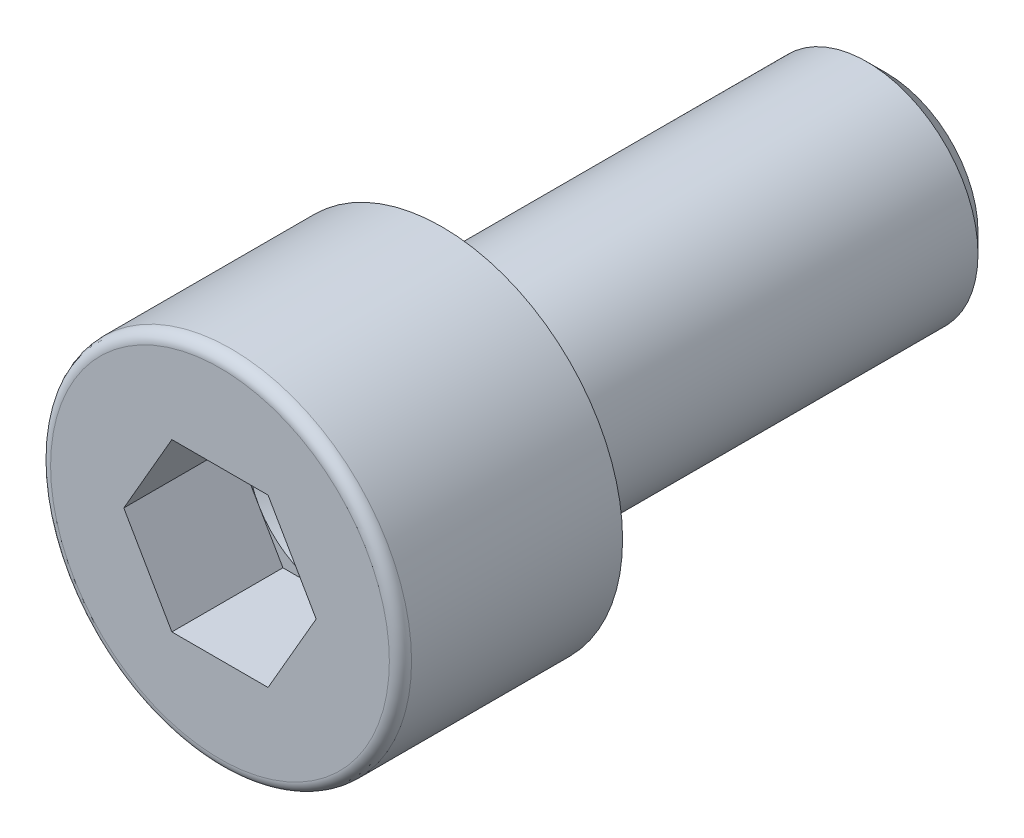
ISO-10303-21;
HEADER;
FILE_DESCRIPTION(('STEP AP214'),'2;1');
FILE_NAME('part.step','',(''),(''),'','','');
FILE_SCHEMA(('AUTOMOTIVE_DESIGN { 1 0 10303 214 1 1 1 1 }'));
ENDSEC;
DATA;
#1=APPLICATION_CONTEXT('core data for automotive mechanical design processes');
#2=APPLICATION_PROTOCOL_DEFINITION('international standard','automotive_design',2000,#1);
#3=PRODUCT_CONTEXT('',#1,'mechanical');
#4=PRODUCT('Part','Part','',(#3));
#5=PRODUCT_RELATED_PRODUCT_CATEGORY('part','',(#4));
#6=PRODUCT_DEFINITION_FORMATION('','',#4);
#7=PRODUCT_DEFINITION_CONTEXT('part definition',#1,'design');
#8=PRODUCT_DEFINITION('design','',#6,#7);
#9=PRODUCT_DEFINITION_SHAPE('','',#8);
#10=(LENGTH_UNIT() NAMED_UNIT(*) SI_UNIT(.MILLI.,.METRE.));
#11=(NAMED_UNIT(*) PLANE_ANGLE_UNIT() SI_UNIT($,.RADIAN.));
#12=(NAMED_UNIT(*) SI_UNIT($,.STERADIAN.) SOLID_ANGLE_UNIT());
#13=UNCERTAINTY_MEASURE_WITH_UNIT(LENGTH_MEASURE(1.E-05),#10,'distance_accuracy_value','');
#14=(GEOMETRIC_REPRESENTATION_CONTEXT(3) GLOBAL_UNCERTAINTY_ASSIGNED_CONTEXT((#13)) GLOBAL_UNIT_ASSIGNED_CONTEXT((#10,
#11,#12)) REPRESENTATION_CONTEXT('',''));
#15=CARTESIAN_POINT('',(0.,0.,0.));
#16=DIRECTION('',(0.,0.,1.));
#17=DIRECTION('',(1.,0.,0.));
#18=AXIS2_PLACEMENT_3D('',#15,#16,#17);
#19=CARTESIAN_POINT('',(0.,0.,20.));
#20=DIRECTION('',(0.,0.,1.));
#21=DIRECTION('',(1.,0.,0.));
#22=AXIS2_PLACEMENT_3D('',#19,#20,#21);
#23=PLANE('',#22);
#24=DIRECTION('',(-0.499999997706082,-0.866025405108833,0.));
#25=VECTOR('',#24,1.);
#26=CARTESIAN_POINT('',(-1.73205080757,3.,20.));
#27=LINE('',#26,#25);
#28=CARTESIAN_POINT('',(-1.73205081286727,2.99999999082487,20.));
#29=VERTEX_POINT('',#28);
#30=CARTESIAN_POINT('',(-2.59807622327162,1.49999997477137,20.0000000091248));
#31=VERTEX_POINT('',#30);
#32=EDGE_CURVE('E148',#29,#31,#27,.T.);
#33=ORIENTED_EDGE('',*,*,#32,.T.);
#34=CARTESIAN_POINT('',(0.,-2.75254019880752E-08,20.0000000070565));
#35=DIRECTION('',(0.,0.,1.));
#36=DIRECTION('',(1.,0.,0.));
#37=AXIS2_PLACEMENT_3D('',#34,#35,#36);
#38=CIRCLE('',#37,3.00000000659944);
#39=CARTESIAN_POINT('',(0.,2.99999998953702,20.0000000077467));
#40=VERTEX_POINT('',#39);
#41=EDGE_CURVE('E367',#31,#40,#38,.F.);
#42=ORIENTED_EDGE('',*,*,#41,.T.);
#43=DIRECTION('',(1.,0.,0.));
#44=VECTOR('',#43,1.);
#45=CARTESIAN_POINT('',(0.,2.9999999862373,20.));
#46=LINE('',#45,#44);
#47=EDGE_CURVE('E158',#40,#29,#46,.F.);
#48=ORIENTED_EDGE('',*,*,#47,.T.);
#49=EDGE_LOOP('',(#33,#42,#48));
#50=FACE_BOUND('',#49,.T.);
#51=ADVANCED_FACE('F17',(#50),#23,.T.);
#52=CARTESIAN_POINT('',(0.,0.,20.));
#53=DIRECTION('',(0.,0.,1.));
#54=DIRECTION('',(1.,0.,0.));
#55=AXIS2_PLACEMENT_3D('',#52,#53,#54);
#56=PLANE('',#55);
#57=DIRECTION('',(1.,0.,0.));
#58=VECTOR('',#57,1.);
#59=CARTESIAN_POINT('',(0.,3.,20.));
#60=LINE('',#59,#58);
#61=CARTESIAN_POINT('',(1.73205080757,3.,20.));
#62=VERTEX_POINT('',#61);
#63=EDGE_CURVE('E136',#62,#40,#60,.F.);
#64=ORIENTED_EDGE('',*,*,#63,.T.);
#65=CARTESIAN_POINT('',(0.,-2.75254019880752E-08,20.0000000084368));
#66=DIRECTION('',(0.,0.,1.));
#67=DIRECTION('',(1.,0.,0.));
#68=AXIS2_PLACEMENT_3D('',#65,#66,#67);
#69=CIRCLE('',#68,3.00000000899022);
#70=CARTESIAN_POINT('',(2.59807621731151,1.49999997591554,20.0000000042184));
#71=VERTEX_POINT('',#70);
#72=EDGE_CURVE('E366',#40,#71,#69,.F.);
#73=ORIENTED_EDGE('',*,*,#72,.T.);
#74=DIRECTION('',(-0.499999996558374,0.866025405771463,0.));
#75=VECTOR('',#74,1.);
#76=CARTESIAN_POINT('',(2.5980762173131,1.4999999759128,20.));
#77=LINE('',#76,#75);
#78=EDGE_CURVE('E142',#71,#62,#77,.T.);
#79=ORIENTED_EDGE('',*,*,#78,.T.);
#80=EDGE_LOOP('',(#64,#73,#79));
#81=FACE_BOUND('',#80,.T.);
#82=ADVANCED_FACE('F229',(#81),#56,.T.);
#83=CARTESIAN_POINT('',(0.,0.,20.));
#84=DIRECTION('',(0.,0.,1.));
#85=DIRECTION('',(1.,0.,0.));
#86=AXIS2_PLACEMENT_3D('',#83,#84,#85);
#87=PLANE('',#86);
#88=DIRECTION('',(-0.500000003442113,0.866025401797133,0.));
#89=VECTOR('',#88,1.);
#90=CARTESIAN_POINT('',(3.46410161514,0.,20.));
#91=LINE('',#90,#89);
#92=CARTESIAN_POINT('',(3.46410161513985,1.6133807901543E-13,20.));
#93=VERTEX_POINT('',#92);
#94=EDGE_CURVE('E135',#93,#71,#91,.T.);
#95=ORIENTED_EDGE('',*,*,#94,.T.);
#96=CARTESIAN_POINT('',(0.,-2.75254019880752E-08,20.));
#97=DIRECTION('',(0.,0.,1.));
#98=DIRECTION('',(1.,0.,0.));
#99=AXIS2_PLACEMENT_3D('',#96,#97,#98);
#100=CIRCLE('',#99,2.99999999437717);
#101=CARTESIAN_POINT('',(2.63316874314574,-1.43866982640077,20.0000864466538));
#102=VERTEX_POINT('',#101);
#103=EDGE_CURVE('E200',#71,#102,#100,.F.);
#104=ORIENTED_EDGE('',*,*,#103,.T.);
#105=DIRECTION('',(0.50000000000019,0.866025403784329,0.));
#106=VECTOR('',#105,1.);
#107=CARTESIAN_POINT('',(1.73205080757,-3.,20.));
#108=LINE('',#107,#106);
#109=EDGE_CURVE('E133',#102,#93,#108,.T.);
#110=ORIENTED_EDGE('',*,*,#109,.T.);
#111=EDGE_LOOP('',(#95,#104,#110));
#112=FACE_BOUND('',#111,.T.);
#113=ADVANCED_FACE('F226',(#112),#87,.T.);
#114=CARTESIAN_POINT('',(0.,0.,20.));
#115=DIRECTION('',(0.,0.,1.));
#116=DIRECTION('',(1.,0.,0.));
#117=AXIS2_PLACEMENT_3D('',#114,#115,#116);
#118=PLANE('',#117);
#119=DIRECTION('',(1.,0.,0.));
#120=VECTOR('',#119,1.);
#121=CARTESIAN_POINT('',(0.,-3.,20.));
#122=LINE('',#121,#120);
#123=CARTESIAN_POINT('',(-1.73205080757006,-3.00000000000004,20.));
#124=VERTEX_POINT('',#123);
#125=CARTESIAN_POINT('',(-0.000203194740943651,-3.,20.0000000012299));
#126=VERTEX_POINT('',#125);
#127=EDGE_CURVE('E119',#124,#126,#122,.T.);
#128=ORIENTED_EDGE('',*,*,#127,.T.);
#129=CARTESIAN_POINT('',(0.,-2.75254019880752E-08,20.0000000024598));
#130=DIRECTION('',(0.,0.,1.));
#131=DIRECTION('',(1.,0.,0.));
#132=AXIS2_PLACEMENT_3D('',#129,#130,#131);
#133=CIRCLE('',#132,2.99999999863771);
#134=CARTESIAN_POINT('',(-2.59807786245244,-1.49999715949278,20.0000000012299));
#135=VERTEX_POINT('',#134);
#136=EDGE_CURVE('E194',#126,#135,#133,.F.);
#137=ORIENTED_EDGE('',*,*,#136,.T.);
#138=DIRECTION('',(0.500000003443144,-0.866025401796539,0.));
#139=VECTOR('',#138,1.);
#140=CARTESIAN_POINT('',(-2.5980795207014,-1.49999428181555,20.));
#141=LINE('',#140,#139);
#142=EDGE_CURVE('E101',#135,#124,#141,.T.);
#143=ORIENTED_EDGE('',*,*,#142,.T.);
#144=EDGE_LOOP('',(#128,#137,#143));
#145=FACE_BOUND('',#144,.T.);
#146=ADVANCED_FACE('F223',(#145),#118,.T.);
#147=CARTESIAN_POINT('',(0.,0.,20.));
#148=DIRECTION('',(0.,0.,1.));
#149=DIRECTION('',(1.,0.,0.));
#150=AXIS2_PLACEMENT_3D('',#147,#148,#149);
#151=PLANE('',#150);
#152=DIRECTION('',(0.499999996557316,-0.866025405772073,0.));
#153=VECTOR('',#152,1.);
#154=CARTESIAN_POINT('',(-3.46410161514,0.,20.));
#155=LINE('',#154,#153);
#156=CARTESIAN_POINT('',(-3.46410161513994,-1.0600341284041E-13,20.));
#157=VERTEX_POINT('',#156);
#158=EDGE_CURVE('E93',#157,#135,#155,.T.);
#159=ORIENTED_EDGE('',*,*,#158,.T.);
#160=CARTESIAN_POINT('',(0.,-2.75254019880752E-08,20.));
#161=DIRECTION('',(0.,0.,1.));
#162=DIRECTION('',(1.,0.,0.));
#163=AXIS2_PLACEMENT_3D('',#160,#161,#162);
#164=CIRCLE('',#163,2.99999999437717);
#165=CARTESIAN_POINT('',(-2.63324148635045,1.4385751483276,20.0001106610875));
#166=VERTEX_POINT('',#165);
#167=EDGE_CURVE('E117',#135,#166,#164,.F.);
#168=ORIENTED_EDGE('',*,*,#167,.T.);
#169=DIRECTION('',(-0.50000000000019,-0.866025403784329,0.));
#170=VECTOR('',#169,1.);
#171=CARTESIAN_POINT('',(-1.73205080757,3.,20.));
#172=LINE('',#171,#170);
#173=EDGE_CURVE('E108',#166,#157,#172,.T.);
#174=ORIENTED_EDGE('',*,*,#173,.T.);
#175=EDGE_LOOP('',(#159,#168,#174));
#176=FACE_BOUND('',#175,.T.);
#177=ADVANCED_FACE('F116',(#176),#151,.T.);
#178=CARTESIAN_POINT('',(0.,-2.75254019880752E-08,20.0106347801352));
#179=DIRECTION('',(0.,0.,1.));
#180=DIRECTION('',(1.,0.,0.));
#181=AXIS2_PLACEMENT_3D('',#178,#179,#180);
#182=CONICAL_SURFACE('',#181,3.01841997384744,1.04719754999236);
#183=CARTESIAN_POINT('',(0.,-2.75690581474919E-08,18.2679491908857));
#184=VERTEX_POINT('',#183);
#185=VERTEX_LOOP('',#184);
#186=FACE_BOUND('',#185,.T.);
#187=ORIENTED_EDGE('',*,*,#136,.F.);
#188=CARTESIAN_POINT('',(0.,-2.75254019880752E-08,20.0000000024598));
#189=DIRECTION('',(0.,0.,1.));
#190=DIRECTION('',(1.,0.,0.));
#191=AXIS2_PLACEMENT_3D('',#188,#189,#190);
#192=CIRCLE('',#191,2.99999999863771);
#193=CARTESIAN_POINT('',(2.59793251552225,-1.50024888711931,20.0000000028538));
#194=VERTEX_POINT('',#193);
#195=EDGE_CURVE('E189',#194,#126,#192,.F.);
#196=ORIENTED_EDGE('',*,*,#195,.F.);
#197=CARTESIAN_POINT('',(2.63340341115152,-1.43881149506311,20.0004802887122));
#198=CARTESIAN_POINT('',(2.62749186796874,-1.44905058820682,20.0003195517201));
#199=CARTESIAN_POINT('',(2.62158018821642,-1.4592899178959,20.0001991594353));
#200=CARTESIAN_POINT('',(2.60975655555363,-1.47976905039789,20.0000390642803));
#201=CARTESIAN_POINT('',(2.60384460264315,-1.49000885321078,19.9999993614102));
#202=CARTESIAN_POINT('',(2.59793251316313,-1.50024889256906,20.0000000032478));
#203=B_SPLINE_CURVE_WITH_KNOTS('',3,(#197,#198,#199,#200,#201,#202),.UNSPECIFIED.,.F.,.F.,(4,2,
4),(0.,0.0354719173220389,0.0709438347585921),.UNSPECIFIED.);
#204=EDGE_CURVE('E198',#102,#194,#203,.T.);
#205=ORIENTED_EDGE('',*,*,#204,.F.);
#206=ORIENTED_EDGE('',*,*,#103,.F.);
#207=ORIENTED_EDGE('',*,*,#72,.F.);
#208=ORIENTED_EDGE('',*,*,#41,.F.);
#209=CARTESIAN_POINT('',(-2.63346274308118,1.43870872914642,20.0004819183828));
#210=CARTESIAN_POINT('',(-2.62756526319753,1.44892346394152,20.0003212947563));
#211=CARTESIAN_POINT('',(-2.62166764660954,1.45913843551547,20.0002008240105));
#212=CARTESIAN_POINT('',(-2.60987214000589,1.47956885225399,20.0000401882803));
#213=CARTESIAN_POINT('',(-2.60397424999023,1.48978429741856,20.0000000232961));
#214=CARTESIAN_POINT('',(-2.59807622327024,1.49999997936198,20.000000011193));
#215=B_SPLINE_CURVE_WITH_KNOTS('',3,(#209,#210,#211,#212,#213,#214),.UNSPECIFIED.,.F.,.F.,(4,2,
4),(0.,0.0353875451237354,0.070775090361553),.UNSPECIFIED.);
#216=EDGE_CURVE('E107',#166,#31,#215,.T.);
#217=ORIENTED_EDGE('',*,*,#216,.F.);
#218=ORIENTED_EDGE('',*,*,#167,.F.);
#219=EDGE_LOOP('',(#187,#196,#205,#206,#207,#208,#217,#218));
#220=FACE_BOUND('',#219,.T.);
#221=ADVANCED_FACE('F213',(#186,#220),#182,.F.);
#222=CARTESIAN_POINT('',(0.,0.,20.));
#223=DIRECTION('',(0.,0.,1.));
#224=DIRECTION('',(1.,0.,0.));
#225=AXIS2_PLACEMENT_3D('',#222,#223,#224);
#226=PLANE('',#225);
#227=DIRECTION('',(-0.50000000000019,-0.866025403784329,0.));
#228=VECTOR('',#227,1.);
#229=CARTESIAN_POINT('',(1.73205080757,-3.,20.));
#230=LINE('',#229,#228);
#231=CARTESIAN_POINT('',(1.73205080757,-3.,20.));
#232=VERTEX_POINT('',#231);
#233=EDGE_CURVE('E172',#194,#232,#230,.T.);
#234=ORIENTED_EDGE('',*,*,#233,.F.);
#235=ORIENTED_EDGE('',*,*,#195,.T.);
#236=DIRECTION('',(1.,0.,0.));
#237=VECTOR('',#236,1.);
#238=CARTESIAN_POINT('',(0.,-3.,20.));
#239=LINE('',#238,#237);
#240=EDGE_CURVE('E192',#126,#232,#239,.T.);
#241=ORIENTED_EDGE('',*,*,#240,.T.);
#242=EDGE_LOOP('',(#234,#235,#241));
#243=FACE_BOUND('',#242,.T.);
#244=ADVANCED_FACE('F218',(#243),#226,.T.);
#245=CARTESIAN_POINT('',(3.46410161514,0.,24.));
#246=DIRECTION('',(-0.866025403784329,-0.50000000000019,0.));
#247=DIRECTION('',(0.50000000000019,-0.866025403784329,0.));
#248=AXIS2_PLACEMENT_3D('',#245,#246,#247);
#249=PLANE('',#248);
#250=ORIENTED_EDGE('',*,*,#94,.F.);
#251=DIRECTION('',(0.,0.,1.));
#252=VECTOR('',#251,1.);
#253=CARTESIAN_POINT('',(3.46410161513982,1.0842021724855E-13,24.));
#254=LINE('',#253,#252);
#255=CARTESIAN_POINT('',(3.46410161513996,0.,24.));
#256=VERTEX_POINT('',#255);
#257=EDGE_CURVE('E169',#256,#93,#254,.F.);
#258=ORIENTED_EDGE('',*,*,#257,.F.);
#259=DIRECTION('',(0.500000000000243,-0.866025403784298,0.));
#260=VECTOR('',#259,1.);
#261=CARTESIAN_POINT('',(1.73205080757,3.,24.));
#262=LINE('',#261,#260);
#263=CARTESIAN_POINT('',(1.73205080757009,3.00000000000005,24.));
#264=VERTEX_POINT('',#263);
#265=EDGE_CURVE('E178',#264,#256,#262,.T.);
#266=ORIENTED_EDGE('',*,*,#265,.F.);
#267=DIRECTION('',(0.,0.,-1.));
#268=VECTOR('',#267,1.);
#269=CARTESIAN_POINT('',(1.73205080757,3.,24.));
#270=LINE('',#269,#268);
#271=EDGE_CURVE('E166',#62,#264,#270,.F.);
#272=ORIENTED_EDGE('',*,*,#271,.F.);
#273=ORIENTED_EDGE('',*,*,#78,.F.);
#274=EDGE_LOOP('',(#250,#258,#266,#272,#273));
#275=FACE_BOUND('',#274,.T.);
#276=ADVANCED_FACE('F362',(#275),#249,.T.);
#277=CARTESIAN_POINT('',(1.73205080757,-3.,24.));
#278=DIRECTION('',(-0.866025403784329,0.50000000000019,0.));
#279=DIRECTION('',(-0.50000000000019,-0.866025403784329,0.));
#280=AXIS2_PLACEMENT_3D('',#277,#278,#279);
#281=PLANE('',#280);
#282=ORIENTED_EDGE('',*,*,#257,.T.);
#283=ORIENTED_EDGE('',*,*,#109,.F.);
#284=ORIENTED_EDGE('',*,*,#204,.T.);
#285=ORIENTED_EDGE('',*,*,#233,.T.);
#286=DIRECTION('',(0.,0.,1.));
#287=VECTOR('',#286,1.);
#288=CARTESIAN_POINT('',(1.73205080757,-3.,24.));
#289=LINE('',#288,#287);
#290=CARTESIAN_POINT('',(1.73205080757,-3.,24.));
#291=VERTEX_POINT('',#290);
#292=EDGE_CURVE('E114',#291,#232,#289,.F.);
#293=ORIENTED_EDGE('',*,*,#292,.F.);
#294=DIRECTION('',(-0.500000000000243,-0.866025403784298,0.));
#295=VECTOR('',#294,1.);
#296=CARTESIAN_POINT('',(3.46410161514,0.,24.));
#297=LINE('',#296,#295);
#298=EDGE_CURVE('E319',#256,#291,#297,.T.);
#299=ORIENTED_EDGE('',*,*,#298,.F.);
#300=EDGE_LOOP('',(#282,#283,#284,#285,#293,#299));
#301=FACE_BOUND('',#300,.T.);
#302=ADVANCED_FACE('F209',(#301),#281,.T.);
#303=CARTESIAN_POINT('',(-1.73205080757,-3.,24.));
#304=DIRECTION('',(0.,1.,0.));
#305=DIRECTION('',(0.,0.,1.));
#306=AXIS2_PLACEMENT_3D('',#303,#304,#305);
#307=PLANE('',#306);
#308=ORIENTED_EDGE('',*,*,#292,.T.);
#309=ORIENTED_EDGE('',*,*,#240,.F.);
#310=ORIENTED_EDGE('',*,*,#127,.F.);
#311=DIRECTION('',(0.,0.,1.));
#312=VECTOR('',#311,1.);
#313=CARTESIAN_POINT('',(-1.73205080757019,-3.00000000000011,24.));
#314=LINE('',#313,#312);
#315=CARTESIAN_POINT('',(-1.73205080757005,-3.00000000000003,24.));
#316=VERTEX_POINT('',#315);
#317=EDGE_CURVE('E113',#316,#124,#314,.F.);
#318=ORIENTED_EDGE('',*,*,#317,.F.);
#319=DIRECTION('',(1.,0.,0.));
#320=VECTOR('',#319,1.);
#321=CARTESIAN_POINT('',(0.,-3.,24.));
#322=LINE('',#321,#320);
#323=EDGE_CURVE('E316',#291,#316,#322,.F.);
#324=ORIENTED_EDGE('',*,*,#323,.F.);
#325=EDGE_LOOP('',(#308,#309,#310,#318,#324));
#326=FACE_BOUND('',#325,.T.);
#327=ADVANCED_FACE('F358',(#326),#307,.T.);
#328=CARTESIAN_POINT('',(-3.46410161514,0.,24.));
#329=DIRECTION('',(0.866025403784329,0.50000000000019,0.));
#330=DIRECTION('',(-0.50000000000019,0.866025403784329,0.));
#331=AXIS2_PLACEMENT_3D('',#328,#329,#330);
#332=PLANE('',#331);
#333=ORIENTED_EDGE('',*,*,#317,.T.);
#334=ORIENTED_EDGE('',*,*,#142,.F.);
#335=ORIENTED_EDGE('',*,*,#158,.F.);
#336=DIRECTION('',(0.,0.,1.));
#337=VECTOR('',#336,1.);
#338=CARTESIAN_POINT('',(-3.46410161514,0.,24.));
#339=LINE('',#338,#337);
#340=CARTESIAN_POINT('',(-3.46410161513991,0.,24.));
#341=VERTEX_POINT('',#340);
#342=EDGE_CURVE('E98',#157,#341,#339,.T.);
#343=ORIENTED_EDGE('',*,*,#342,.T.);
#344=DIRECTION('',(-0.500000000000243,0.866025403784298,0.));
#345=VECTOR('',#344,1.);
#346=CARTESIAN_POINT('',(-1.73205080757,-3.,24.));
#347=LINE('',#346,#345);
#348=EDGE_CURVE('E314',#316,#341,#347,.T.);
#349=ORIENTED_EDGE('',*,*,#348,.F.);
#350=EDGE_LOOP('',(#333,#334,#335,#343,#349));
#351=FACE_BOUND('',#350,.T.);
#352=ADVANCED_FACE('F96',(#351),#332,.T.);
#353=CARTESIAN_POINT('',(-1.73205080757,3.,24.));
#354=DIRECTION('',(0.866025403784329,-0.50000000000019,0.));
#355=DIRECTION('',(0.50000000000019,0.866025403784329,0.));
#356=AXIS2_PLACEMENT_3D('',#353,#354,#355);
#357=PLANE('',#356);
#358=DIRECTION('',(0.499999999748507,0.866025403929638,0.));
#359=VECTOR('',#358,1.);
#360=CARTESIAN_POINT('',(-2.63347110075448,1.43869425218376,24.));
#361=LINE('',#360,#359);
#362=CARTESIAN_POINT('',(-1.73205080757,3.,24.));
#363=VERTEX_POINT('',#362);
#364=EDGE_CURVE('E112',#341,#363,#361,.T.);
#365=ORIENTED_EDGE('',*,*,#364,.F.);
#366=ORIENTED_EDGE('',*,*,#342,.F.);
#367=ORIENTED_EDGE('',*,*,#173,.F.);
#368=ORIENTED_EDGE('',*,*,#216,.T.);
#369=ORIENTED_EDGE('',*,*,#32,.F.);
#370=DIRECTION('',(0.,0.,-1.));
#371=VECTOR('',#370,1.);
#372=CARTESIAN_POINT('',(-1.73205080757,3.,24.));
#373=LINE('',#372,#371);
#374=EDGE_CURVE('E35',#363,#29,#373,.T.);
#375=ORIENTED_EDGE('',*,*,#374,.F.);
#376=EDGE_LOOP('',(#365,#366,#367,#368,#369,#375));
#377=FACE_BOUND('',#376,.T.);
#378=ADVANCED_FACE('F110',(#377),#357,.T.);
#379=CARTESIAN_POINT('',(1.73205080757,3.,24.));
#380=DIRECTION('',(0.,-1.,0.));
#381=DIRECTION('',(0.,0.,-1.));
#382=AXIS2_PLACEMENT_3D('',#379,#380,#381);
#383=PLANE('',#382);
#384=ORIENTED_EDGE('',*,*,#374,.T.);
#385=ORIENTED_EDGE('',*,*,#47,.F.);
#386=ORIENTED_EDGE('',*,*,#63,.F.);
#387=ORIENTED_EDGE('',*,*,#271,.T.);
#388=DIRECTION('',(1.,0.,0.));
#389=VECTOR('',#388,1.);
#390=CARTESIAN_POINT('',(0.,3.,24.));
#391=LINE('',#390,#389);
#392=EDGE_CURVE('E305',#363,#264,#391,.T.);
#393=ORIENTED_EDGE('',*,*,#392,.F.);
#394=EDGE_LOOP('',(#384,#385,#386,#387,#393));
#395=FACE_BOUND('',#394,.T.);
#396=ADVANCED_FACE('F373',(#395),#383,.T.);
#397=CARTESIAN_POINT('',(0.,0.,24.));
#398=DIRECTION('',(0.,0.,1.));
#399=DIRECTION('',(1.,0.,0.));
#400=AXIS2_PLACEMENT_3D('',#397,#398,#399);
#401=PLANE('',#400);
#402=ORIENTED_EDGE('',*,*,#364,.T.);
#403=ORIENTED_EDGE('',*,*,#392,.T.);
#404=ORIENTED_EDGE('',*,*,#265,.T.);
#405=ORIENTED_EDGE('',*,*,#298,.T.);
#406=ORIENTED_EDGE('',*,*,#323,.T.);
#407=ORIENTED_EDGE('',*,*,#348,.T.);
#408=EDGE_LOOP('',(#402,#403,#404,#405,#406,#407));
#409=FACE_BOUND('',#408,.T.);
#410=CARTESIAN_POINT('',(0.,0.,24.));
#411=DIRECTION('',(0.,0.,-1.));
#412=DIRECTION('',(-0.999999999999999,-4.49714271034472E-08,0.));
#413=AXIS2_PLACEMENT_3D('',#410,#411,#412);
#414=CIRCLE('',#413,6.10000000000001);
#415=CARTESIAN_POINT('',(-6.1,-2.74325703554671E-07,24.));
#416=VERTEX_POINT('',#415);
#417=EDGE_CURVE('E301',#416,#416,#414,.T.);
#418=ORIENTED_EDGE('',*,*,#417,.F.);
#419=EDGE_LOOP('',(#418));
#420=FACE_BOUND('',#419,.T.);
#421=ADVANCED_FACE('F287',(#409,#420),#401,.T.);
#422=CARTESIAN_POINT('',(0.,0.,23.6));
#423=DIRECTION('',(0.,0.,1.));
#424=DIRECTION('',(1.,0.,0.));
#425=AXIS2_PLACEMENT_3D('',#422,#423,#424);
#426=TOROIDAL_SURFACE('',#425,6.1,0.4);
#427=CARTESIAN_POINT('',(0.,0.,23.6));
#428=DIRECTION('',(0.,0.,1.));
#429=DIRECTION('',(1.,0.,0.));
#430=AXIS2_PLACEMENT_3D('',#427,#428,#429);
#431=CIRCLE('',#430,6.5);
#432=CARTESIAN_POINT('',(6.5,0.,23.6));
#433=VERTEX_POINT('',#432);
#434=EDGE_CURVE('E188',#433,#433,#431,.F.);
#435=ORIENTED_EDGE('',*,*,#434,.F.);
#436=EDGE_LOOP('',(#435));
#437=FACE_BOUND('',#436,.T.);
#438=ORIENTED_EDGE('',*,*,#417,.T.);
#439=EDGE_LOOP('',(#438));
#440=FACE_BOUND('',#439,.T.);
#441=ADVANCED_FACE('F281',(#437,#440),#426,.T.);
#442=CARTESIAN_POINT('',(0.,0.,12.));
#443=DIRECTION('',(0.,0.,1.));
#444=DIRECTION('',(1.,0.,0.));
#445=AXIS2_PLACEMENT_3D('',#442,#443,#444);
#446=CYLINDRICAL_SURFACE('',#445,6.5);
#447=CARTESIAN_POINT('',(0.,0.,16.));
#448=DIRECTION('',(0.,0.,1.));
#449=DIRECTION('',(1.,0.,0.));
#450=AXIS2_PLACEMENT_3D('',#447,#448,#449);
#451=CIRCLE('',#450,6.5);
#452=CARTESIAN_POINT('',(6.5,0.,16.));
#453=VERTEX_POINT('',#452);
#454=EDGE_CURVE('E185',#453,#453,#451,.F.);
#455=ORIENTED_EDGE('',*,*,#454,.F.);
#456=EDGE_LOOP('',(#455));
#457=FACE_BOUND('',#456,.T.);
#458=ORIENTED_EDGE('',*,*,#434,.T.);
#459=EDGE_LOOP('',(#458));
#460=FACE_BOUND('',#459,.T.);
#461=ADVANCED_FACE('F278',(#457,#460),#446,.T.);
#462=CARTESIAN_POINT('',(0.,0.,16.));
#463=DIRECTION('',(0.,0.,-1.));
#464=DIRECTION('',(-1.,0.,0.));
#465=AXIS2_PLACEMENT_3D('',#462,#463,#464);
#466=PLANE('',#465);
#467=CARTESIAN_POINT('',(0.,0.,16.));
#468=DIRECTION('',(0.,0.,-1.));
#469=DIRECTION('',(-1.,0.,0.));
#470=AXIS2_PLACEMENT_3D('',#467,#468,#469);
#471=CIRCLE('',#470,4.39999999999999);
#472=CARTESIAN_POINT('',(-4.40000000000001,0.,16.));
#473=VERTEX_POINT('',#472);
#474=EDGE_CURVE('E184',#473,#473,#471,.F.);
#475=ORIENTED_EDGE('',*,*,#474,.T.);
#476=EDGE_LOOP('',(#475));
#477=FACE_BOUND('',#476,.T.);
#478=ORIENTED_EDGE('',*,*,#454,.T.);
#479=EDGE_LOOP('',(#478));
#480=FACE_BOUND('',#479,.T.);
#481=ADVANCED_FACE('F269',(#477,#480),#466,.T.);
#482=CARTESIAN_POINT('',(0.,0.,0.));
#483=DIRECTION('',(0.,0.,1.));
#484=DIRECTION('',(1.,0.,0.));
#485=AXIS2_PLACEMENT_3D('',#482,#483,#484);
#486=PLANE('',#485);
#487=CARTESIAN_POINT('',(1.4256038860971E-13,0.,2.10253234093905E-09));
#488=DIRECTION('',(-2.04277241964694E-13,0.,1.));
#489=DIRECTION('',(1.,0.,2.04277241964694E-13));
#490=AXIS2_PLACEMENT_3D('',#487,#488,#489);
#491=CIRCLE('',#490,3.29999999797778);
#492=CARTESIAN_POINT('',(3.29999999797792,0.,2.10320645583712E-09));
#493=VERTEX_POINT('',#492);
#494=EDGE_CURVE('E181',#493,#493,#491,.T.);
#495=ORIENTED_EDGE('',*,*,#494,.F.);
#496=EDGE_LOOP('',(#495));
#497=FACE_BOUND('',#496,.T.);
#498=ADVANCED_FACE('F253',(#497),#486,.F.);
#499=CARTESIAN_POINT('',(0.,0.,15.6));
#500=DIRECTION('',(0.,0.,-1.));
#501=DIRECTION('',(-1.,0.,0.));
#502=AXIS2_PLACEMENT_3D('',#499,#500,#501);
#503=TOROIDAL_SURFACE('',#502,4.4,0.4);
#504=ORIENTED_EDGE('',*,*,#474,.F.);
#505=EDGE_LOOP('',(#504));
#506=FACE_BOUND('',#505,.T.);
#507=CARTESIAN_POINT('',(0.,0.,15.6));
#508=DIRECTION('',(0.,0.,-1.));
#509=DIRECTION('',(-1.,0.,0.));
#510=AXIS2_PLACEMENT_3D('',#507,#508,#509);
#511=CIRCLE('',#510,4.);
#512=CARTESIAN_POINT('',(-4.,0.,15.6));
#513=VERTEX_POINT('',#512);
#514=EDGE_CURVE('E26',#513,#513,#511,.T.);
#515=ORIENTED_EDGE('',*,*,#514,.F.);
#516=EDGE_LOOP('',(#515));
#517=FACE_BOUND('',#516,.T.);
#518=ADVANCED_FACE('F244',(#506,#517),#503,.F.);
#519=CARTESIAN_POINT('',(0.,0.,0.700000002608796));
#520=DIRECTION('',(-2.04277241964694E-13,0.,1.));
#521=DIRECTION('',(1.,0.,2.04277241964694E-13));
#522=AXIS2_PLACEMENT_3D('',#519,#520,#521);
#523=CONICAL_SURFACE('',#522,3.99999999723377,0.785398162504399);
#524=CARTESIAN_POINT('',(0.,0.,0.7));
#525=DIRECTION('',(0.,0.,-1.));
#526=DIRECTION('',(-1.,0.,0.));
#527=AXIS2_PLACEMENT_3D('',#524,#525,#526);
#528=CIRCLE('',#527,4.);
#529=CARTESIAN_POINT('',(-4.,0.,0.7));
#530=VERTEX_POINT('',#529);
#531=EDGE_CURVE('E11',#530,#530,#528,.F.);
#532=ORIENTED_EDGE('',*,*,#531,.F.);
#533=EDGE_LOOP('',(#532));
#534=FACE_BOUND('',#533,.T.);
#535=ORIENTED_EDGE('',*,*,#494,.T.);
#536=EDGE_LOOP('',(#535));
#537=FACE_BOUND('',#536,.T.);
#538=ADVANCED_FACE('F238',(#534,#537),#523,.T.);
#539=CARTESIAN_POINT('',(0.,0.,8.));
#540=DIRECTION('',(0.,0.,-1.));
#541=DIRECTION('',(-1.,0.,0.));
#542=AXIS2_PLACEMENT_3D('',#539,#540,#541);
#543=CYLINDRICAL_SURFACE('',#542,4.);
#544=ORIENTED_EDGE('',*,*,#531,.T.);
#545=EDGE_LOOP('',(#544));
#546=FACE_BOUND('',#545,.T.);
#547=ORIENTED_EDGE('',*,*,#514,.T.);
#548=EDGE_LOOP('',(#547));
#549=FACE_BOUND('',#548,.T.);
#550=ADVANCED_FACE('F236',(#546,#549),#543,.T.);
#551=CLOSED_SHELL('',(#51,#82,#113,#146,#177,#221,#244,#276,#302,#327,#352,#378,#396,#421,#441,
#461,#481,#498,#518,#538,#550));
#552=MANIFOLD_SOLID_BREP('B1',#551);
#553=ADVANCED_BREP_SHAPE_REPRESENTATION('',(#18,#552),#14);
#554=SHAPE_DEFINITION_REPRESENTATION(#9,#553);
ENDSEC;
END-ISO-10303-21;
